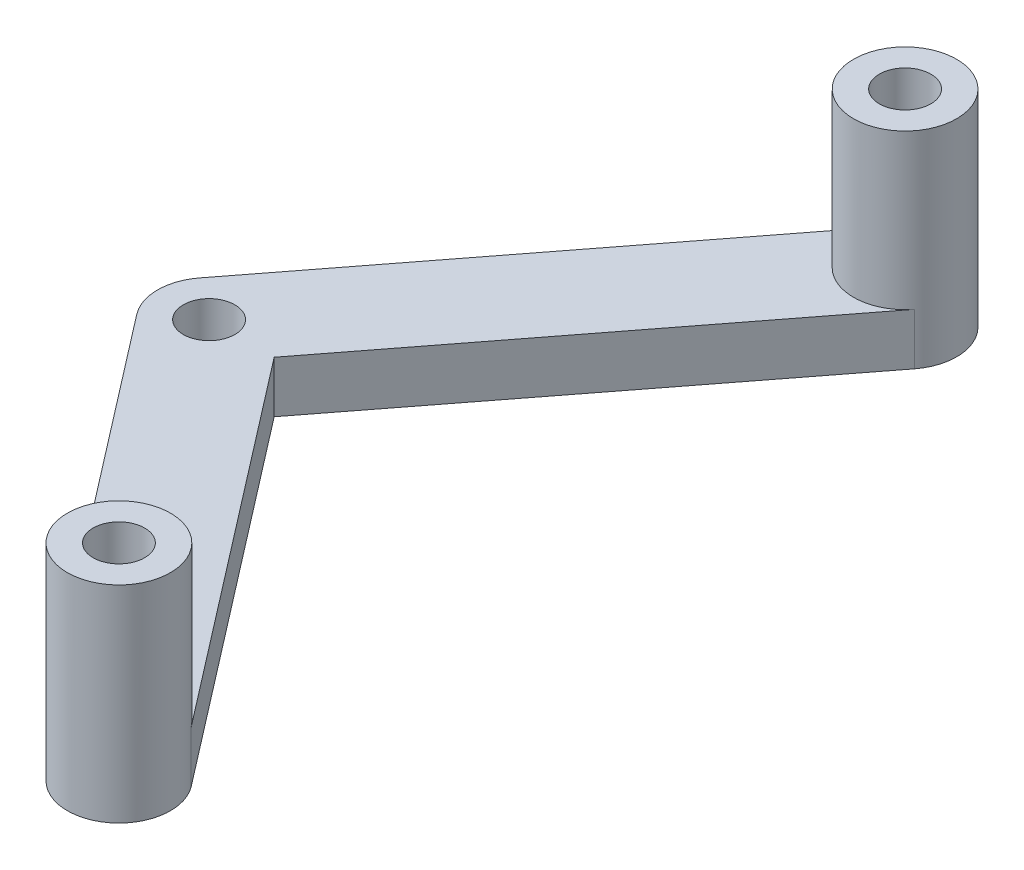
ISO-10303-21;
HEADER;
FILE_DESCRIPTION(('STEP AP214'),'2;1');
FILE_NAME('part.step','',(''),(''),'','','');
FILE_SCHEMA(('AUTOMOTIVE_DESIGN { 1 0 10303 214 1 1 1 1 }'));
ENDSEC;
DATA;
#1=APPLICATION_CONTEXT('core data for automotive mechanical design processes');
#2=APPLICATION_PROTOCOL_DEFINITION('international standard','automotive_design',2000,#1);
#3=PRODUCT_CONTEXT('',#1,'mechanical');
#4=PRODUCT('Part','Part','',(#3));
#5=PRODUCT_RELATED_PRODUCT_CATEGORY('part','',(#4));
#6=PRODUCT_DEFINITION_FORMATION('','',#4);
#7=PRODUCT_DEFINITION_CONTEXT('part definition',#1,'design');
#8=PRODUCT_DEFINITION('design','',#6,#7);
#9=PRODUCT_DEFINITION_SHAPE('','',#8);
#10=(LENGTH_UNIT() NAMED_UNIT(*) SI_UNIT(.MILLI.,.METRE.));
#11=(NAMED_UNIT(*) PLANE_ANGLE_UNIT() SI_UNIT($,.RADIAN.));
#12=(NAMED_UNIT(*) SI_UNIT($,.STERADIAN.) SOLID_ANGLE_UNIT());
#13=UNCERTAINTY_MEASURE_WITH_UNIT(LENGTH_MEASURE(1.E-05),#10,'distance_accuracy_value','');
#14=(GEOMETRIC_REPRESENTATION_CONTEXT(3) GLOBAL_UNCERTAINTY_ASSIGNED_CONTEXT((#13)) GLOBAL_UNIT_ASSIGNED_CONTEXT((#10,
#11,#12)) REPRESENTATION_CONTEXT('',''));
#15=CARTESIAN_POINT('',(0.,0.,0.));
#16=DIRECTION('',(0.,0.,1.));
#17=DIRECTION('',(1.,0.,0.));
#18=AXIS2_PLACEMENT_3D('',#15,#16,#17);
#19=CARTESIAN_POINT('',(11.75,2.,-15.2479506819769));
#20=DIRECTION('',(0.,1.,0.));
#21=DIRECTION('',(0.,0.,1.));
#22=AXIS2_PLACEMENT_3D('',#19,#20,#21);
#23=PLANE('',#22);
#24=CARTESIAN_POINT('',(11.75,2.,-15.2479506819769));
#25=DIRECTION('',(0.,1.,0.));
#26=DIRECTION('',(0.,0.,1.));
#27=AXIS2_PLACEMENT_3D('',#24,#25,#26);
#28=CIRCLE('',#27,2.);
#29=CARTESIAN_POINT('',(10.1657973317427,2.,-16.4687299027561));
#30=VERTEX_POINT('',#29);
#31=CARTESIAN_POINT('',(13.3342026682573,2.,-14.0271714611977));
#32=VERTEX_POINT('',#31);
#33=EDGE_CURVE('E11',#30,#32,#28,.T.);
#34=ORIENTED_EDGE('',*,*,#33,.F.);
#35=DIRECTION('',(-0.61038961038961,0.,0.792101334128671));
#36=VECTOR('',#35,1.);
#37=CARTESIAN_POINT('',(10.1657973317427,2.,-16.4687299027561));
#38=LINE('',#37,#36);
#39=CARTESIAN_POINT('',(-1.58420266825734,2.,-1.22077922077922));
#40=VERTEX_POINT('',#39);
#41=EDGE_CURVE('E111',#30,#40,#38,.T.);
#42=ORIENTED_EDGE('',*,*,#41,.T.);
#43=CARTESIAN_POINT('',(0.,2.,0.));
#44=DIRECTION('',(0.,1.,0.));
#45=DIRECTION('',(0.,0.,-1.));
#46=AXIS2_PLACEMENT_3D('',#43,#44,#45);
#47=CIRCLE('',#46,2.);
#48=CARTESIAN_POINT('',(-1.58420266825734,2.,1.22077922077922));
#49=VERTEX_POINT('',#48);
#50=EDGE_CURVE('E105',#40,#49,#47,.T.);
#51=ORIENTED_EDGE('',*,*,#50,.T.);
#52=DIRECTION('',(0.61038961038961,0.,0.792101334128671));
#53=VECTOR('',#52,1.);
#54=CARTESIAN_POINT('',(10.1657973317426,2.,16.4687299027561));
#55=LINE('',#54,#53);
#56=CARTESIAN_POINT('',(10.1657973317426,2.,16.4687299027561));
#57=VERTEX_POINT('',#56);
#58=EDGE_CURVE('E109',#49,#57,#55,.T.);
#59=ORIENTED_EDGE('',*,*,#58,.T.);
#60=CARTESIAN_POINT('',(11.75,2.,15.2479506819769));
#61=DIRECTION('',(0.,1.,0.));
#62=DIRECTION('',(0.,0.,1.));
#63=AXIS2_PLACEMENT_3D('',#60,#61,#62);
#64=CIRCLE('',#63,2.);
#65=CARTESIAN_POINT('',(13.3342026682573,2.,14.0271714611977));
#66=VERTEX_POINT('',#65);
#67=EDGE_CURVE('E169',#66,#57,#64,.T.);
#68=ORIENTED_EDGE('',*,*,#67,.F.);
#69=DIRECTION('',(-0.61038961038961,0.,-0.792101334128671));
#70=VECTOR('',#69,1.);
#71=CARTESIAN_POINT('',(13.3342026682573,2.,14.0271714611977));
#72=LINE('',#71,#70);
#73=CARTESIAN_POINT('',(2.52492946776823,2.,0.));
#74=VERTEX_POINT('',#73);
#75=EDGE_CURVE('E59',#66,#74,#72,.T.);
#76=ORIENTED_EDGE('',*,*,#75,.T.);
#77=DIRECTION('',(0.61038961038961,0.,-0.792101334128671));
#78=VECTOR('',#77,1.);
#79=CARTESIAN_POINT('',(13.3342026682573,2.,-14.0271714611977));
#80=LINE('',#79,#78);
#81=EDGE_CURVE('E130',#74,#32,#80,.T.);
#82=ORIENTED_EDGE('',*,*,#81,.T.);
#83=EDGE_LOOP('',(#34,#42,#51,#59,#68,#76,#82));
#84=FACE_BOUND('',#83,.T.);
#85=CARTESIAN_POINT('',(0.,2.,0.));
#86=DIRECTION('',(0.,1.,0.));
#87=DIRECTION('',(0.,0.,1.));
#88=AXIS2_PLACEMENT_3D('',#85,#86,#87);
#89=CIRCLE('',#88,1.);
#90=CARTESIAN_POINT('',(0.,2.,1.));
#91=VERTEX_POINT('',#90);
#92=EDGE_CURVE('E140',#91,#91,#89,.T.);
#93=ORIENTED_EDGE('',*,*,#92,.F.);
#94=EDGE_LOOP('',(#93));
#95=FACE_BOUND('',#94,.T.);
#96=ADVANCED_FACE('F41',(#84,#95),#23,.T.);
#97=CARTESIAN_POINT('',(11.75,0.,-15.2479506819769));
#98=DIRECTION('',(0.,1.,0.));
#99=DIRECTION('',(0.,0.,1.));
#100=AXIS2_PLACEMENT_3D('',#97,#98,#99);
#101=PLANE('',#100);
#102=CARTESIAN_POINT('',(11.75,0.,-15.2479506819769));
#103=DIRECTION('',(0.,1.,0.));
#104=DIRECTION('',(0.,0.,1.));
#105=AXIS2_PLACEMENT_3D('',#102,#103,#104);
#106=CIRCLE('',#105,2.);
#107=CARTESIAN_POINT('',(13.3342026682573,0.,-14.0271714611977));
#108=VERTEX_POINT('',#107);
#109=CARTESIAN_POINT('',(10.1657973317427,0.,-16.4687299027561));
#110=VERTEX_POINT('',#109);
#111=EDGE_CURVE('E136',#108,#110,#106,.T.);
#112=ORIENTED_EDGE('',*,*,#111,.F.);
#113=DIRECTION('',(0.61038961038961,0.,-0.792101334128671));
#114=VECTOR('',#113,1.);
#115=CARTESIAN_POINT('',(13.3342026682573,0.,-14.0271714611977));
#116=LINE('',#115,#114);
#117=CARTESIAN_POINT('',(2.52492946776823,0.,0.));
#118=VERTEX_POINT('',#117);
#119=EDGE_CURVE('E93',#118,#108,#116,.T.);
#120=ORIENTED_EDGE('',*,*,#119,.F.);
#121=DIRECTION('',(-0.61038961038961,0.,-0.792101334128671));
#122=VECTOR('',#121,1.);
#123=CARTESIAN_POINT('',(13.3342026682573,0.,14.0271714611977));
#124=LINE('',#123,#122);
#125=CARTESIAN_POINT('',(13.3342026682573,0.,14.0271714611977));
#126=VERTEX_POINT('',#125);
#127=EDGE_CURVE('E86',#126,#118,#124,.T.);
#128=ORIENTED_EDGE('',*,*,#127,.F.);
#129=CARTESIAN_POINT('',(11.75,0.,15.2479506819769));
#130=DIRECTION('',(0.,1.,0.));
#131=DIRECTION('',(0.,0.,-1.));
#132=AXIS2_PLACEMENT_3D('',#129,#130,#131);
#133=CIRCLE('',#132,2.);
#134=CARTESIAN_POINT('',(10.1657973317426,0.,16.4687299027561));
#135=VERTEX_POINT('',#134);
#136=EDGE_CURVE('E145',#135,#126,#133,.T.);
#137=ORIENTED_EDGE('',*,*,#136,.F.);
#138=DIRECTION('',(0.61038961038961,0.,0.792101334128671));
#139=VECTOR('',#138,1.);
#140=CARTESIAN_POINT('',(10.1657973317426,0.,16.4687299027561));
#141=LINE('',#140,#139);
#142=CARTESIAN_POINT('',(-1.58420266825734,0.,1.22077922077922));
#143=VERTEX_POINT('',#142);
#144=EDGE_CURVE('E143',#143,#135,#141,.T.);
#145=ORIENTED_EDGE('',*,*,#144,.F.);
#146=CARTESIAN_POINT('',(0.,0.,0.));
#147=DIRECTION('',(0.,1.,0.));
#148=DIRECTION('',(0.,0.,-1.));
#149=AXIS2_PLACEMENT_3D('',#146,#147,#148);
#150=CIRCLE('',#149,2.);
#151=CARTESIAN_POINT('',(-1.58420266825734,0.,-1.22077922077922));
#152=VERTEX_POINT('',#151);
#153=EDGE_CURVE('E120',#152,#143,#150,.T.);
#154=ORIENTED_EDGE('',*,*,#153,.F.);
#155=DIRECTION('',(-0.61038961038961,0.,0.792101334128671));
#156=VECTOR('',#155,1.);
#157=CARTESIAN_POINT('',(10.1657973317427,0.,-16.4687299027561));
#158=LINE('',#157,#156);
#159=EDGE_CURVE('E139',#110,#152,#158,.T.);
#160=ORIENTED_EDGE('',*,*,#159,.F.);
#161=EDGE_LOOP('',(#112,#120,#128,#137,#145,#154,#160));
#162=FACE_BOUND('',#161,.T.);
#163=CARTESIAN_POINT('',(0.,0.,0.));
#164=DIRECTION('',(0.,1.,0.));
#165=DIRECTION('',(0.,0.,1.));
#166=AXIS2_PLACEMENT_3D('',#163,#164,#165);
#167=CIRCLE('',#166,1.);
#168=CARTESIAN_POINT('',(0.,0.,1.));
#169=VERTEX_POINT('',#168);
#170=EDGE_CURVE('E188',#169,#169,#167,.T.);
#171=ORIENTED_EDGE('',*,*,#170,.T.);
#172=EDGE_LOOP('',(#171));
#173=FACE_BOUND('',#172,.T.);
#174=CARTESIAN_POINT('',(11.75,0.,-15.2479506819769));
#175=DIRECTION('',(0.,1.,0.));
#176=DIRECTION('',(0.,0.,1.));
#177=AXIS2_PLACEMENT_3D('',#174,#175,#176);
#178=CIRCLE('',#177,1.);
#179=CARTESIAN_POINT('',(11.75,0.,-14.2479506819769));
#180=VERTEX_POINT('',#179);
#181=EDGE_CURVE('E184',#180,#180,#178,.T.);
#182=ORIENTED_EDGE('',*,*,#181,.T.);
#183=EDGE_LOOP('',(#182));
#184=FACE_BOUND('',#183,.T.);
#185=CARTESIAN_POINT('',(11.75,0.,15.2479506819769));
#186=DIRECTION('',(0.,1.,0.));
#187=DIRECTION('',(0.,0.,-1.));
#188=AXIS2_PLACEMENT_3D('',#185,#186,#187);
#189=CIRCLE('',#188,1.);
#190=CARTESIAN_POINT('',(11.75,0.,14.2479506819769));
#191=VERTEX_POINT('',#190);
#192=EDGE_CURVE('E181',#191,#191,#189,.T.);
#193=ORIENTED_EDGE('',*,*,#192,.T.);
#194=EDGE_LOOP('',(#193));
#195=FACE_BOUND('',#194,.T.);
#196=ADVANCED_FACE('F162',(#162,#173,#184,#195),#101,.F.);
#197=CARTESIAN_POINT('',(11.75,2.,-15.2479506819769));
#198=DIRECTION('',(0.,-1.,0.));
#199=DIRECTION('',(0.,0.,-1.));
#200=AXIS2_PLACEMENT_3D('',#197,#198,#199);
#201=CYLINDRICAL_SURFACE('',#200,2.);
#202=ORIENTED_EDGE('',*,*,#111,.T.);
#203=DIRECTION('',(0.,-1.,0.));
#204=VECTOR('',#203,1.);
#205=CARTESIAN_POINT('',(10.1657973317427,2.,-16.4687299027561));
#206=LINE('',#205,#204);
#207=EDGE_CURVE('E45',#30,#110,#206,.T.);
#208=ORIENTED_EDGE('',*,*,#207,.F.);
#209=ORIENTED_EDGE('',*,*,#33,.T.);
#210=DIRECTION('',(0.,-1.,0.));
#211=VECTOR('',#210,1.);
#212=CARTESIAN_POINT('',(13.3342026682573,2.,-14.0271714611977));
#213=LINE('',#212,#211);
#214=EDGE_CURVE('E135',#32,#108,#213,.T.);
#215=ORIENTED_EDGE('',*,*,#214,.T.);
#216=EDGE_LOOP('',(#202,#208,#209,#215));
#217=FACE_BOUND('',#216,.T.);
#218=CARTESIAN_POINT('',(11.75,8.,-15.2479506819769));
#219=DIRECTION('',(0.,1.,0.));
#220=DIRECTION('',(0.,0.,1.));
#221=AXIS2_PLACEMENT_3D('',#218,#219,#220);
#222=CIRCLE('',#221,2.);
#223=CARTESIAN_POINT('',(11.75,8.,-13.2479506819769));
#224=VERTEX_POINT('',#223);
#225=EDGE_CURVE('E185',#224,#224,#222,.T.);
#226=ORIENTED_EDGE('',*,*,#225,.F.);
#227=EDGE_LOOP('',(#226));
#228=FACE_BOUND('',#227,.T.);
#229=ADVANCED_FACE('F43',(#217,#228),#201,.T.);
#230=CARTESIAN_POINT('',(10.1657973317427,2.,-16.4687299027561));
#231=DIRECTION('',(0.792101334128671,0.,0.61038961038961));
#232=DIRECTION('',(0.61038961038961,0.,-0.792101334128671));
#233=AXIS2_PLACEMENT_3D('',#230,#231,#232);
#234=PLANE('',#233);
#235=ORIENTED_EDGE('',*,*,#159,.T.);
#236=DIRECTION('',(0.,-1.,0.));
#237=VECTOR('',#236,1.);
#238=CARTESIAN_POINT('',(-1.58420266825734,2.,-1.22077922077922));
#239=LINE('',#238,#237);
#240=EDGE_CURVE('E123',#40,#152,#239,.T.);
#241=ORIENTED_EDGE('',*,*,#240,.F.);
#242=ORIENTED_EDGE('',*,*,#41,.F.);
#243=ORIENTED_EDGE('',*,*,#207,.T.);
#244=EDGE_LOOP('',(#235,#241,#242,#243));
#245=FACE_BOUND('',#244,.T.);
#246=ADVANCED_FACE('F157',(#245),#234,.F.);
#247=CARTESIAN_POINT('',(0.,2.,0.));
#248=DIRECTION('',(0.,-1.,0.));
#249=DIRECTION('',(0.,0.,-1.));
#250=AXIS2_PLACEMENT_3D('',#247,#248,#249);
#251=CYLINDRICAL_SURFACE('',#250,2.);
#252=ORIENTED_EDGE('',*,*,#153,.T.);
#253=DIRECTION('',(0.,-1.,0.));
#254=VECTOR('',#253,1.);
#255=CARTESIAN_POINT('',(-1.58420266825734,2.,1.22077922077922));
#256=LINE('',#255,#254);
#257=EDGE_CURVE('E117',#49,#143,#256,.T.);
#258=ORIENTED_EDGE('',*,*,#257,.F.);
#259=ORIENTED_EDGE('',*,*,#50,.F.);
#260=ORIENTED_EDGE('',*,*,#240,.T.);
#261=EDGE_LOOP('',(#252,#258,#259,#260));
#262=FACE_BOUND('',#261,.T.);
#263=ADVANCED_FACE('F118',(#262),#251,.T.);
#264=CARTESIAN_POINT('',(10.1657973317426,2.,16.4687299027561));
#265=DIRECTION('',(0.792101334128671,0.,-0.61038961038961));
#266=DIRECTION('',(-0.61038961038961,0.,-0.792101334128671));
#267=AXIS2_PLACEMENT_3D('',#264,#265,#266);
#268=PLANE('',#267);
#269=ORIENTED_EDGE('',*,*,#144,.T.);
#270=DIRECTION('',(0.,-1.,0.));
#271=VECTOR('',#270,1.);
#272=CARTESIAN_POINT('',(10.1657973317426,2.,16.4687299027561));
#273=LINE('',#272,#271);
#274=EDGE_CURVE('E124',#57,#135,#273,.T.);
#275=ORIENTED_EDGE('',*,*,#274,.F.);
#276=ORIENTED_EDGE('',*,*,#58,.F.);
#277=ORIENTED_EDGE('',*,*,#257,.T.);
#278=EDGE_LOOP('',(#269,#275,#276,#277));
#279=FACE_BOUND('',#278,.T.);
#280=ADVANCED_FACE('F126',(#279),#268,.F.);
#281=CARTESIAN_POINT('',(11.75,2.,15.2479506819769));
#282=DIRECTION('',(0.,-1.,0.));
#283=DIRECTION('',(0.,0.,-1.));
#284=AXIS2_PLACEMENT_3D('',#281,#282,#283);
#285=CYLINDRICAL_SURFACE('',#284,2.);
#286=ORIENTED_EDGE('',*,*,#136,.T.);
#287=DIRECTION('',(0.,-1.,0.));
#288=VECTOR('',#287,1.);
#289=CARTESIAN_POINT('',(13.3342026682573,2.,14.0271714611977));
#290=LINE('',#289,#288);
#291=EDGE_CURVE('E152',#66,#126,#290,.T.);
#292=ORIENTED_EDGE('',*,*,#291,.F.);
#293=ORIENTED_EDGE('',*,*,#67,.T.);
#294=ORIENTED_EDGE('',*,*,#274,.T.);
#295=EDGE_LOOP('',(#286,#292,#293,#294));
#296=FACE_BOUND('',#295,.T.);
#297=CARTESIAN_POINT('',(11.75,8.,15.2479506819769));
#298=DIRECTION('',(0.,1.,0.));
#299=DIRECTION('',(0.,0.,1.));
#300=AXIS2_PLACEMENT_3D('',#297,#298,#299);
#301=CIRCLE('',#300,2.);
#302=CARTESIAN_POINT('',(11.75,8.,17.2479506819769));
#303=VERTEX_POINT('',#302);
#304=EDGE_CURVE('E172',#303,#303,#301,.T.);
#305=ORIENTED_EDGE('',*,*,#304,.F.);
#306=EDGE_LOOP('',(#305));
#307=FACE_BOUND('',#306,.T.);
#308=ADVANCED_FACE('F166',(#296,#307),#285,.T.);
#309=CARTESIAN_POINT('',(13.3342026682573,2.,14.0271714611977));
#310=DIRECTION('',(-0.792101334128671,0.,0.61038961038961));
#311=DIRECTION('',(0.61038961038961,0.,0.792101334128671));
#312=AXIS2_PLACEMENT_3D('',#309,#310,#311);
#313=PLANE('',#312);
#314=ORIENTED_EDGE('',*,*,#127,.T.);
#315=DIRECTION('',(0.,-1.,0.));
#316=VECTOR('',#315,1.);
#317=CARTESIAN_POINT('',(2.52492946776823,2.,0.));
#318=LINE('',#317,#316);
#319=EDGE_CURVE('E150',#74,#118,#318,.T.);
#320=ORIENTED_EDGE('',*,*,#319,.F.);
#321=ORIENTED_EDGE('',*,*,#75,.F.);
#322=ORIENTED_EDGE('',*,*,#291,.T.);
#323=EDGE_LOOP('',(#314,#320,#321,#322));
#324=FACE_BOUND('',#323,.T.);
#325=ADVANCED_FACE('F209',(#324),#313,.F.);
#326=CARTESIAN_POINT('',(13.3342026682573,2.,-14.0271714611977));
#327=DIRECTION('',(-0.792101334128671,0.,-0.61038961038961));
#328=DIRECTION('',(-0.61038961038961,0.,0.792101334128671));
#329=AXIS2_PLACEMENT_3D('',#326,#327,#328);
#330=PLANE('',#329);
#331=ORIENTED_EDGE('',*,*,#119,.T.);
#332=ORIENTED_EDGE('',*,*,#214,.F.);
#333=ORIENTED_EDGE('',*,*,#81,.F.);
#334=ORIENTED_EDGE('',*,*,#319,.T.);
#335=EDGE_LOOP('',(#331,#332,#333,#334));
#336=FACE_BOUND('',#335,.T.);
#337=ADVANCED_FACE('F198',(#336),#330,.F.);
#338=CARTESIAN_POINT('',(0.,2.,0.));
#339=DIRECTION('',(0.,-1.,0.));
#340=DIRECTION('',(0.,0.,-1.));
#341=AXIS2_PLACEMENT_3D('',#338,#339,#340);
#342=CYLINDRICAL_SURFACE('',#341,1.);
#343=ORIENTED_EDGE('',*,*,#92,.T.);
#344=EDGE_LOOP('',(#343));
#345=FACE_BOUND('',#344,.T.);
#346=ORIENTED_EDGE('',*,*,#170,.F.);
#347=EDGE_LOOP('',(#346));
#348=FACE_BOUND('',#347,.T.);
#349=ADVANCED_FACE('F195',(#345,#348),#342,.F.);
#350=CARTESIAN_POINT('',(11.75,2.,-15.2479506819769));
#351=DIRECTION('',(0.,-1.,0.));
#352=DIRECTION('',(0.,0.,-1.));
#353=AXIS2_PLACEMENT_3D('',#350,#351,#352);
#354=CYLINDRICAL_SURFACE('',#353,1.);
#355=ORIENTED_EDGE('',*,*,#181,.F.);
#356=EDGE_LOOP('',(#355));
#357=FACE_BOUND('',#356,.T.);
#358=CARTESIAN_POINT('',(11.75,8.,-15.2479506819769));
#359=DIRECTION('',(0.,1.,0.));
#360=DIRECTION('',(0.,0.,1.));
#361=AXIS2_PLACEMENT_3D('',#358,#359,#360);
#362=CIRCLE('',#361,1.00000000000001);
#363=CARTESIAN_POINT('',(11.75,8.,-14.2479506819769));
#364=VERTEX_POINT('',#363);
#365=EDGE_CURVE('E175',#364,#364,#362,.T.);
#366=ORIENTED_EDGE('',*,*,#365,.T.);
#367=EDGE_LOOP('',(#366));
#368=FACE_BOUND('',#367,.T.);
#369=ADVANCED_FACE('F197',(#357,#368),#354,.F.);
#370=CARTESIAN_POINT('',(11.75,2.,15.2479506819769));
#371=DIRECTION('',(0.,-1.,0.));
#372=DIRECTION('',(0.,0.,-1.));
#373=AXIS2_PLACEMENT_3D('',#370,#371,#372);
#374=CYLINDRICAL_SURFACE('',#373,1.);
#375=ORIENTED_EDGE('',*,*,#192,.F.);
#376=EDGE_LOOP('',(#375));
#377=FACE_BOUND('',#376,.T.);
#378=CARTESIAN_POINT('',(11.75,8.,15.2479506819769));
#379=DIRECTION('',(0.,1.,0.));
#380=DIRECTION('',(0.,0.,1.));
#381=AXIS2_PLACEMENT_3D('',#378,#379,#380);
#382=CIRCLE('',#381,1.);
#383=CARTESIAN_POINT('',(11.75,8.,16.2479506819769));
#384=VERTEX_POINT('',#383);
#385=EDGE_CURVE('E171',#384,#384,#382,.T.);
#386=ORIENTED_EDGE('',*,*,#385,.T.);
#387=EDGE_LOOP('',(#386));
#388=FACE_BOUND('',#387,.T.);
#389=ADVANCED_FACE('F206',(#377,#388),#374,.F.);
#390=CARTESIAN_POINT('',(11.75,8.,15.2479506819769));
#391=DIRECTION('',(0.,1.,0.));
#392=DIRECTION('',(0.,0.,1.));
#393=AXIS2_PLACEMENT_3D('',#390,#391,#392);
#394=PLANE('',#393);
#395=ORIENTED_EDGE('',*,*,#304,.T.);
#396=EDGE_LOOP('',(#395));
#397=FACE_BOUND('',#396,.T.);
#398=ORIENTED_EDGE('',*,*,#385,.F.);
#399=EDGE_LOOP('',(#398));
#400=FACE_BOUND('',#399,.T.);
#401=ADVANCED_FACE('F264',(#397,#400),#394,.T.);
#402=CARTESIAN_POINT('',(11.75,8.,-15.2479506819769));
#403=DIRECTION('',(0.,1.,0.));
#404=DIRECTION('',(0.,0.,1.));
#405=AXIS2_PLACEMENT_3D('',#402,#403,#404);
#406=PLANE('',#405);
#407=ORIENTED_EDGE('',*,*,#225,.T.);
#408=EDGE_LOOP('',(#407));
#409=FACE_BOUND('',#408,.T.);
#410=ORIENTED_EDGE('',*,*,#365,.F.);
#411=EDGE_LOOP('',(#410));
#412=FACE_BOUND('',#411,.T.);
#413=ADVANCED_FACE('F273',(#409,#412),#406,.T.);
#414=CLOSED_SHELL('',(#96,#196,#229,#246,#263,#280,#308,#325,#337,#349,#369,#389,#401,#413));
#415=MANIFOLD_SOLID_BREP('B2',#414);
#416=ADVANCED_BREP_SHAPE_REPRESENTATION('',(#18,#415),#14);
#417=SHAPE_DEFINITION_REPRESENTATION(#9,#416);
ENDSEC;
END-ISO-10303-21;
